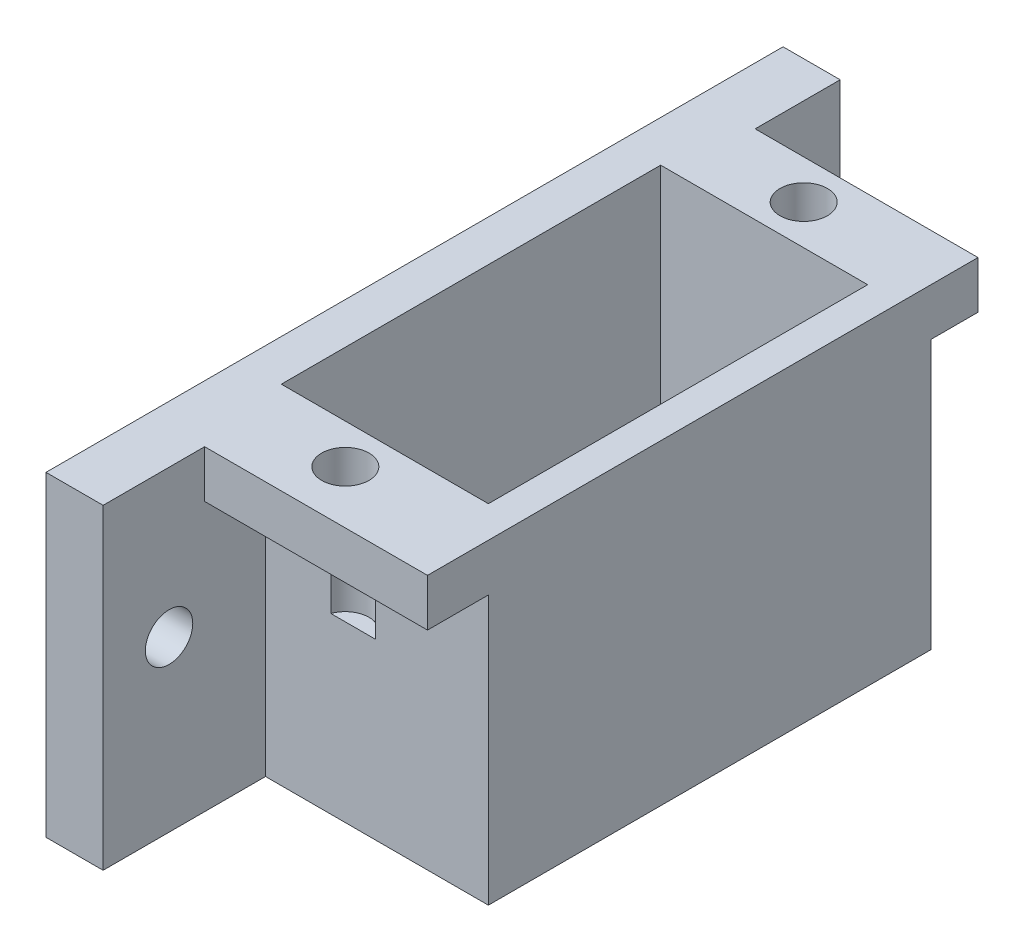
ISO-10303-21;
HEADER;
FILE_DESCRIPTION(('STEP AP214'),'2;1');
FILE_NAME('part.step','',(''),(''),'','','');
FILE_SCHEMA(('AUTOMOTIVE_DESIGN { 1 0 10303 214 1 1 1 1 }'));
ENDSEC;
DATA;
#1=APPLICATION_CONTEXT('core data for automotive mechanical design processes');
#2=APPLICATION_PROTOCOL_DEFINITION('international standard','automotive_design',2000,#1);
#3=PRODUCT_CONTEXT('',#1,'mechanical');
#4=PRODUCT('Part','Part','',(#3));
#5=PRODUCT_RELATED_PRODUCT_CATEGORY('part','',(#4));
#6=PRODUCT_DEFINITION_FORMATION('','',#4);
#7=PRODUCT_DEFINITION_CONTEXT('part definition',#1,'design');
#8=PRODUCT_DEFINITION('design','',#6,#7);
#9=PRODUCT_DEFINITION_SHAPE('','',#8);
#10=(LENGTH_UNIT() NAMED_UNIT(*) SI_UNIT(.MILLI.,.METRE.));
#11=(NAMED_UNIT(*) PLANE_ANGLE_UNIT() SI_UNIT($,.RADIAN.));
#12=(NAMED_UNIT(*) SI_UNIT($,.STERADIAN.) SOLID_ANGLE_UNIT());
#13=UNCERTAINTY_MEASURE_WITH_UNIT(LENGTH_MEASURE(1.E-05),#10,'distance_accuracy_value','');
#14=(GEOMETRIC_REPRESENTATION_CONTEXT(3) GLOBAL_UNCERTAINTY_ASSIGNED_CONTEXT((#13)) GLOBAL_UNIT_ASSIGNED_CONTEXT((#10,
#11,#12)) REPRESENTATION_CONTEXT('',''));
#15=CARTESIAN_POINT('',(0.,0.,0.));
#16=DIRECTION('',(0.,0.,1.));
#17=DIRECTION('',(1.,0.,0.));
#18=AXIS2_PLACEMENT_3D('',#15,#16,#17);
#19=CARTESIAN_POINT('',(0.,20.,-18.5));
#20=DIRECTION('',(0.,0.,-1.));
#21=DIRECTION('',(-1.,0.,0.));
#22=AXIS2_PLACEMENT_3D('',#19,#20,#21);
#23=PLANE('',#22);
#24=DIRECTION('',(0.,-1.,0.));
#25=VECTOR('',#24,1.);
#26=CARTESIAN_POINT('',(37.7037052749013,20.,-18.5));
#27=LINE('',#26,#25);
#28=CARTESIAN_POINT('',(37.7037052749013,17.,-18.5));
#29=VERTEX_POINT('',#28);
#30=CARTESIAN_POINT('',(37.7037052749013,0.,-18.5));
#31=VERTEX_POINT('',#30);
#32=EDGE_CURVE('E229',#29,#31,#27,.T.);
#33=ORIENTED_EDGE('',*,*,#32,.F.);
#34=DIRECTION('',(-1.,0.,0.));
#35=VECTOR('',#34,1.);
#36=CARTESIAN_POINT('',(0.,17.,-18.5));
#37=LINE('',#36,#35);
#38=CARTESIAN_POINT('',(41.8394917125282,17.,-18.5));
#39=VERTEX_POINT('',#38);
#40=EDGE_CURVE('E411',#39,#29,#37,.T.);
#41=ORIENTED_EDGE('',*,*,#40,.F.);
#42=DIRECTION('',(0.,-1.,0.));
#43=VECTOR('',#42,1.);
#44=CARTESIAN_POINT('',(41.8394917125282,20.,-18.5));
#45=LINE('',#44,#43);
#46=CARTESIAN_POINT('',(41.8394917125282,11.,-18.5));
#47=VERTEX_POINT('',#46);
#48=EDGE_CURVE('E51',#39,#47,#45,.T.);
#49=ORIENTED_EDGE('',*,*,#48,.T.);
#50=DIRECTION('',(1.,0.,0.));
#51=VECTOR('',#50,1.);
#52=CARTESIAN_POINT('',(0.,11.,-18.5));
#53=LINE('',#52,#51);
#54=CARTESIAN_POINT('',(44.6679188372744,11.,-18.5));
#55=VERTEX_POINT('',#54);
#56=EDGE_CURVE('E196',#47,#55,#53,.T.);
#57=ORIENTED_EDGE('',*,*,#56,.T.);
#58=DIRECTION('',(0.,-1.,0.));
#59=VECTOR('',#58,1.);
#60=CARTESIAN_POINT('',(44.6679188372744,20.,-18.5));
#61=LINE('',#60,#59);
#62=CARTESIAN_POINT('',(44.6679188372744,17.,-18.5));
#63=VERTEX_POINT('',#62);
#64=EDGE_CURVE('E11',#63,#55,#61,.T.);
#65=ORIENTED_EDGE('',*,*,#64,.F.);
#66=DIRECTION('',(-1.,0.,0.));
#67=VECTOR('',#66,1.);
#68=CARTESIAN_POINT('',(0.,17.,-18.5));
#69=LINE('',#68,#67);
#70=CARTESIAN_POINT('',(51.8037052749013,17.,-18.5));
#71=VERTEX_POINT('',#70);
#72=EDGE_CURVE('E62',#71,#63,#69,.T.);
#73=ORIENTED_EDGE('',*,*,#72,.F.);
#74=DIRECTION('',(0.,-1.,0.));
#75=VECTOR('',#74,1.);
#76=CARTESIAN_POINT('',(51.8037052749013,20.,-18.5));
#77=LINE('',#76,#75);
#78=CARTESIAN_POINT('',(51.8037052749013,0.,-18.5));
#79=VERTEX_POINT('',#78);
#80=EDGE_CURVE('E209',#71,#79,#77,.T.);
#81=ORIENTED_EDGE('',*,*,#80,.T.);
#82=DIRECTION('',(1.,0.,0.));
#83=VECTOR('',#82,1.);
#84=CARTESIAN_POINT('',(0.,0.,-18.5));
#85=LINE('',#84,#83);
#86=EDGE_CURVE('E284',#31,#79,#85,.T.);
#87=ORIENTED_EDGE('',*,*,#86,.F.);
#88=EDGE_LOOP('',(#33,#41,#49,#57,#65,#73,#81,#87));
#89=FACE_BOUND('',#88,.T.);
#90=ADVANCED_FACE('F41',(#89),#23,.T.);
#91=CARTESIAN_POINT('',(37.7037052749013,20.,0.));
#92=DIRECTION('',(-1.,0.,0.));
#93=DIRECTION('',(0.,0.,1.));
#94=AXIS2_PLACEMENT_3D('',#91,#92,#93);
#95=PLANE('',#94);
#96=CARTESIAN_POINT('',(37.7037052749013,10.2861607324723,-22.5684218846652));
#97=DIRECTION('',(-1.,0.,0.));
#98=DIRECTION('',(0.,0.,1.));
#99=AXIS2_PLACEMENT_3D('',#96,#97,#98);
#100=CIRCLE('',#99,1.5);
#101=CARTESIAN_POINT('',(37.7037052749013,10.2861607324723,-21.0684218846652));
#102=VERTEX_POINT('',#101);
#103=EDGE_CURVE('E301',#102,#102,#100,.F.);
#104=ORIENTED_EDGE('',*,*,#103,.F.);
#105=EDGE_LOOP('',(#104));
#106=FACE_BOUND('',#105,.T.);
#107=DIRECTION('',(0.,1.,0.));
#108=VECTOR('',#107,1.);
#109=CARTESIAN_POINT('',(37.7037052749013,17.,-21.4784011385849));
#110=LINE('',#109,#108);
#111=CARTESIAN_POINT('',(37.7037052749013,17.,-21.4784011385849));
#112=VERTEX_POINT('',#111);
#113=CARTESIAN_POINT('',(37.7037052749013,20.,-21.4784011385849));
#114=VERTEX_POINT('',#113);
#115=EDGE_CURVE('E368',#112,#114,#110,.T.);
#116=ORIENTED_EDGE('',*,*,#115,.F.);
#117=DIRECTION('',(0.,0.,1.));
#118=VECTOR('',#117,1.);
#119=CARTESIAN_POINT('',(37.7037052749013,17.,0.));
#120=LINE('',#119,#118);
#121=EDGE_CURVE('E407',#112,#29,#120,.T.);
#122=ORIENTED_EDGE('',*,*,#121,.T.);
#123=ORIENTED_EDGE('',*,*,#32,.T.);
#124=DIRECTION('',(0.,0.,-1.));
#125=VECTOR('',#124,1.);
#126=CARTESIAN_POINT('',(37.7037052749013,0.,0.));
#127=LINE('',#126,#125);
#128=CARTESIAN_POINT('',(37.7037052749013,0.,-26.8576345121729));
#129=VERTEX_POINT('',#128);
#130=EDGE_CURVE('E280',#31,#129,#127,.T.);
#131=ORIENTED_EDGE('',*,*,#130,.T.);
#132=DIRECTION('',(0.,-1.,0.));
#133=VECTOR('',#132,1.);
#134=CARTESIAN_POINT('',(37.7037052749013,20.,-26.8576345121729));
#135=LINE('',#134,#133);
#136=CARTESIAN_POINT('',(37.7037052749013,20.,-26.8576345121729));
#137=VERTEX_POINT('',#136);
#138=EDGE_CURVE('E226',#137,#129,#135,.T.);
#139=ORIENTED_EDGE('',*,*,#138,.F.);
#140=DIRECTION('',(0.,0.,-1.));
#141=VECTOR('',#140,1.);
#142=CARTESIAN_POINT('',(37.7037052749013,20.,0.));
#143=LINE('',#142,#141);
#144=EDGE_CURVE('E323',#114,#137,#143,.T.);
#145=ORIENTED_EDGE('',*,*,#144,.F.);
#146=EDGE_LOOP('',(#116,#122,#123,#131,#139,#145));
#147=FACE_BOUND('',#146,.T.);
#148=ADVANCED_FACE('F442',(#106,#147),#95,.F.);
#149=CARTESIAN_POINT('',(0.,20.,9.49999999999999));
#150=DIRECTION('',(0.,0.,-1.));
#151=DIRECTION('',(-1.,0.,0.));
#152=AXIS2_PLACEMENT_3D('',#149,#150,#151);
#153=PLANE('',#152);
#154=DIRECTION('',(-1.,0.,0.));
#155=VECTOR('',#154,1.);
#156=CARTESIAN_POINT('',(0.,17.,9.49999999999999));
#157=LINE('',#156,#155);
#158=CARTESIAN_POINT('',(51.8037052749013,17.,9.5));
#159=VERTEX_POINT('',#158);
#160=CARTESIAN_POINT('',(44.6679188372744,17.,9.5));
#161=VERTEX_POINT('',#160);
#162=EDGE_CURVE('E201',#159,#161,#157,.T.);
#163=ORIENTED_EDGE('',*,*,#162,.T.);
#164=DIRECTION('',(0.,-1.,0.));
#165=VECTOR('',#164,1.);
#166=CARTESIAN_POINT('',(44.6679188372744,20.,9.5));
#167=LINE('',#166,#165);
#168=CARTESIAN_POINT('',(44.6679188372744,11.,9.5));
#169=VERTEX_POINT('',#168);
#170=EDGE_CURVE('E193',#161,#169,#167,.T.);
#171=ORIENTED_EDGE('',*,*,#170,.T.);
#172=DIRECTION('',(1.,0.,0.));
#173=VECTOR('',#172,1.);
#174=CARTESIAN_POINT('',(0.,11.,9.49999999999999));
#175=LINE('',#174,#173);
#176=CARTESIAN_POINT('',(41.8394917125282,11.,9.5));
#177=VERTEX_POINT('',#176);
#178=EDGE_CURVE('E179',#177,#169,#175,.T.);
#179=ORIENTED_EDGE('',*,*,#178,.F.);
#180=DIRECTION('',(0.,-1.,0.));
#181=VECTOR('',#180,1.);
#182=CARTESIAN_POINT('',(41.8394917125282,20.,9.5));
#183=LINE('',#182,#181);
#184=CARTESIAN_POINT('',(41.8394917125282,17.,9.5));
#185=VERTEX_POINT('',#184);
#186=EDGE_CURVE('E194',#185,#177,#183,.T.);
#187=ORIENTED_EDGE('',*,*,#186,.F.);
#188=DIRECTION('',(-1.,0.,0.));
#189=VECTOR('',#188,1.);
#190=CARTESIAN_POINT('',(0.,17.,9.49999999999999));
#191=LINE('',#190,#189);
#192=CARTESIAN_POINT('',(37.7037052749013,17.,9.5));
#193=VERTEX_POINT('',#192);
#194=EDGE_CURVE('E379',#185,#193,#191,.T.);
#195=ORIENTED_EDGE('',*,*,#194,.T.);
#196=DIRECTION('',(0.,-1.,0.));
#197=VECTOR('',#196,1.);
#198=CARTESIAN_POINT('',(37.7037052749013,20.,9.5));
#199=LINE('',#198,#197);
#200=CARTESIAN_POINT('',(37.7037052749013,0.,9.5));
#201=VERTEX_POINT('',#200);
#202=EDGE_CURVE('E207',#193,#201,#199,.T.);
#203=ORIENTED_EDGE('',*,*,#202,.T.);
#204=DIRECTION('',(1.,0.,0.));
#205=VECTOR('',#204,1.);
#206=CARTESIAN_POINT('',(0.,0.,9.49999999999999));
#207=LINE('',#206,#205);
#208=CARTESIAN_POINT('',(51.8037052749013,0.,9.5));
#209=VERTEX_POINT('',#208);
#210=EDGE_CURVE('E260',#201,#209,#207,.T.);
#211=ORIENTED_EDGE('',*,*,#210,.T.);
#212=DIRECTION('',(0.,-1.,0.));
#213=VECTOR('',#212,1.);
#214=CARTESIAN_POINT('',(51.8037052749013,20.,9.5));
#215=LINE('',#214,#213);
#216=EDGE_CURVE('E203',#159,#209,#215,.T.);
#217=ORIENTED_EDGE('',*,*,#216,.F.);
#218=EDGE_LOOP('',(#163,#171,#179,#187,#195,#203,#211,#217));
#219=FACE_BOUND('',#218,.T.);
#220=ADVANCED_FACE('F199',(#219),#153,.F.);
#221=CARTESIAN_POINT('',(43.2537052749013,20.,-19.));
#222=DIRECTION('',(0.,-1.,0.));
#223=DIRECTION('',(0.,0.,-1.));
#224=AXIS2_PLACEMENT_3D('',#221,#222,#223);
#225=CYLINDRICAL_SURFACE('',#224,1.5);
#226=CARTESIAN_POINT('',(43.2537052749013,11.,-19.));
#227=DIRECTION('',(0.,1.,0.));
#228=DIRECTION('',(0.,0.,1.));
#229=AXIS2_PLACEMENT_3D('',#226,#227,#228);
#230=CIRCLE('',#229,1.5);
#231=EDGE_CURVE('E400',#47,#55,#230,.T.);
#232=ORIENTED_EDGE('',*,*,#231,.F.);
#233=ORIENTED_EDGE('',*,*,#48,.F.);
#234=CARTESIAN_POINT('',(43.2537052749013,17.,-19.));
#235=DIRECTION('',(0.,1.,0.));
#236=DIRECTION('',(0.,0.,1.));
#237=AXIS2_PLACEMENT_3D('',#234,#235,#236);
#238=CIRCLE('',#237,1.5);
#239=EDGE_CURVE('E414',#63,#39,#238,.T.);
#240=ORIENTED_EDGE('',*,*,#239,.F.);
#241=ORIENTED_EDGE('',*,*,#64,.T.);
#242=EDGE_LOOP('',(#232,#233,#240,#241));
#243=FACE_BOUND('',#242,.T.);
#244=CARTESIAN_POINT('',(43.2537052749013,20.,-19.));
#245=DIRECTION('',(0.,1.,0.));
#246=DIRECTION('',(0.,0.,1.));
#247=AXIS2_PLACEMENT_3D('',#244,#245,#246);
#248=CIRCLE('',#247,1.5);
#249=CARTESIAN_POINT('',(43.2537052749013,20.,-17.5));
#250=VERTEX_POINT('',#249);
#251=EDGE_CURVE('E326',#250,#250,#248,.T.);
#252=ORIENTED_EDGE('',*,*,#251,.T.);
#253=EDGE_LOOP('',(#252));
#254=FACE_BOUND('',#253,.T.);
#255=ADVANCED_FACE('F428',(#243,#254),#225,.F.);
#256=CARTESIAN_POINT('',(0.,20.,-26.8576345121729));
#257=DIRECTION('',(0.,0.,-1.));
#258=DIRECTION('',(-1.,0.,0.));
#259=AXIS2_PLACEMENT_3D('',#256,#257,#258);
#260=PLANE('',#259);
#261=DIRECTION('',(1.,0.,0.));
#262=VECTOR('',#261,1.);
#263=CARTESIAN_POINT('',(0.,0.,-26.8576345121729));
#264=LINE('',#263,#262);
#265=CARTESIAN_POINT('',(34.0906998355112,0.,-26.8576345121729));
#266=VERTEX_POINT('',#265);
#267=EDGE_CURVE('E276',#266,#129,#264,.T.);
#268=ORIENTED_EDGE('',*,*,#267,.F.);
#269=DIRECTION('',(0.,-1.,0.));
#270=VECTOR('',#269,1.);
#271=CARTESIAN_POINT('',(34.0906998355112,20.,-26.8576345121729));
#272=LINE('',#271,#270);
#273=CARTESIAN_POINT('',(34.0906998355112,20.,-26.8576345121729));
#274=VERTEX_POINT('',#273);
#275=EDGE_CURVE('E223',#274,#266,#272,.T.);
#276=ORIENTED_EDGE('',*,*,#275,.F.);
#277=DIRECTION('',(1.,0.,0.));
#278=VECTOR('',#277,1.);
#279=CARTESIAN_POINT('',(0.,20.,-26.8576345121729));
#280=LINE('',#279,#278);
#281=EDGE_CURVE('E319',#274,#137,#280,.T.);
#282=ORIENTED_EDGE('',*,*,#281,.T.);
#283=ORIENTED_EDGE('',*,*,#138,.T.);
#284=EDGE_LOOP('',(#268,#276,#282,#283));
#285=FACE_BOUND('',#284,.T.);
#286=ADVANCED_FACE('F475',(#285),#260,.T.);
#287=CARTESIAN_POINT('',(34.0906998355112,20.,0.));
#288=DIRECTION('',(1.,0.,0.));
#289=DIRECTION('',(0.,0.,-1.));
#290=AXIS2_PLACEMENT_3D('',#287,#288,#289);
#291=PLANE('',#290);
#292=CARTESIAN_POINT('',(34.0906998355112,10.6942498464128,15.6035460262899));
#293=DIRECTION('',(1.,0.,0.));
#294=DIRECTION('',(0.,0.,-1.));
#295=AXIS2_PLACEMENT_3D('',#292,#293,#294);
#296=CIRCLE('',#295,1.5);
#297=CARTESIAN_POINT('',(34.0906998355112,10.6942498464128,14.1035460262899));
#298=VERTEX_POINT('',#297);
#299=EDGE_CURVE('E351',#298,#298,#296,.T.);
#300=ORIENTED_EDGE('',*,*,#299,.T.);
#301=EDGE_LOOP('',(#300));
#302=FACE_BOUND('',#301,.T.);
#303=CARTESIAN_POINT('',(34.0906998355112,10.2861607324723,-22.5684218846652));
#304=DIRECTION('',(1.,0.,0.));
#305=DIRECTION('',(0.,0.,-1.));
#306=AXIS2_PLACEMENT_3D('',#303,#304,#305);
#307=CIRCLE('',#306,1.5);
#308=CARTESIAN_POINT('',(34.0906998355112,10.2861607324723,-24.0684218846652));
#309=VERTEX_POINT('',#308);
#310=EDGE_CURVE('E347',#309,#309,#307,.T.);
#311=ORIENTED_EDGE('',*,*,#310,.T.);
#312=EDGE_LOOP('',(#311));
#313=FACE_BOUND('',#312,.T.);
#314=DIRECTION('',(0.,0.,1.));
#315=VECTOR('',#314,1.);
#316=CARTESIAN_POINT('',(34.0906998355112,0.,0.));
#317=LINE('',#316,#315);
#318=CARTESIAN_POINT('',(34.0906998355112,0.,19.7761726632711));
#319=VERTEX_POINT('',#318);
#320=EDGE_CURVE('E272',#266,#319,#317,.T.);
#321=ORIENTED_EDGE('',*,*,#320,.T.);
#322=DIRECTION('',(0.,-1.,0.));
#323=VECTOR('',#322,1.);
#324=CARTESIAN_POINT('',(34.0906998355112,20.,19.7761726632711));
#325=LINE('',#324,#323);
#326=CARTESIAN_POINT('',(34.0906998355112,20.,19.7761726632711));
#327=VERTEX_POINT('',#326);
#328=EDGE_CURVE('E219',#327,#319,#325,.T.);
#329=ORIENTED_EDGE('',*,*,#328,.F.);
#330=DIRECTION('',(0.,0.,1.));
#331=VECTOR('',#330,1.);
#332=CARTESIAN_POINT('',(34.0906998355112,20.,0.));
#333=LINE('',#332,#331);
#334=EDGE_CURVE('E315',#274,#327,#333,.T.);
#335=ORIENTED_EDGE('',*,*,#334,.F.);
#336=ORIENTED_EDGE('',*,*,#275,.T.);
#337=EDGE_LOOP('',(#321,#329,#335,#336));
#338=FACE_BOUND('',#337,.T.);
#339=ADVANCED_FACE('F473',(#302,#313,#338),#291,.F.);
#340=CARTESIAN_POINT('',(0.,20.,19.7761726632711));
#341=DIRECTION('',(0.,0.,-1.));
#342=DIRECTION('',(-1.,0.,0.));
#343=AXIS2_PLACEMENT_3D('',#340,#341,#342);
#344=PLANE('',#343);
#345=DIRECTION('',(1.,0.,0.));
#346=VECTOR('',#345,1.);
#347=CARTESIAN_POINT('',(0.,0.,19.7761726632711));
#348=LINE('',#347,#346);
#349=CARTESIAN_POINT('',(37.7037052749013,0.,19.7761726632711));
#350=VERTEX_POINT('',#349);
#351=EDGE_CURVE('E268',#319,#350,#348,.T.);
#352=ORIENTED_EDGE('',*,*,#351,.T.);
#353=DIRECTION('',(0.,-1.,0.));
#354=VECTOR('',#353,1.);
#355=CARTESIAN_POINT('',(37.7037052749013,20.,19.7761726632711));
#356=LINE('',#355,#354);
#357=CARTESIAN_POINT('',(37.7037052749013,20.,19.7761726632711));
#358=VERTEX_POINT('',#357);
#359=EDGE_CURVE('E216',#358,#350,#356,.T.);
#360=ORIENTED_EDGE('',*,*,#359,.F.);
#361=DIRECTION('',(1.,0.,0.));
#362=VECTOR('',#361,1.);
#363=CARTESIAN_POINT('',(0.,20.,19.7761726632711));
#364=LINE('',#363,#362);
#365=EDGE_CURVE('E311',#327,#358,#364,.T.);
#366=ORIENTED_EDGE('',*,*,#365,.F.);
#367=ORIENTED_EDGE('',*,*,#328,.T.);
#368=EDGE_LOOP('',(#352,#360,#366,#367));
#369=FACE_BOUND('',#368,.T.);
#370=ADVANCED_FACE('F470',(#369),#344,.F.);
#371=CARTESIAN_POINT('',(37.7037052749013,20.,0.));
#372=DIRECTION('',(1.,0.,0.));
#373=DIRECTION('',(0.,0.,-1.));
#374=AXIS2_PLACEMENT_3D('',#371,#372,#373);
#375=PLANE('',#374);
#376=DIRECTION('',(0.,1.,0.));
#377=VECTOR('',#376,1.);
#378=CARTESIAN_POINT('',(37.7037052749013,17.,13.3519435182929));
#379=LINE('',#378,#377);
#380=CARTESIAN_POINT('',(37.7037052749013,17.,13.3519435182929));
#381=VERTEX_POINT('',#380);
#382=CARTESIAN_POINT('',(37.7037052749013,20.,13.3519435182929));
#383=VERTEX_POINT('',#382);
#384=EDGE_CURVE('E356',#381,#383,#379,.T.);
#385=ORIENTED_EDGE('',*,*,#384,.T.);
#386=DIRECTION('',(0.,0.,1.));
#387=VECTOR('',#386,1.);
#388=CARTESIAN_POINT('',(37.7037052749013,20.,0.));
#389=LINE('',#388,#387);
#390=EDGE_CURVE('E308',#383,#358,#389,.T.);
#391=ORIENTED_EDGE('',*,*,#390,.T.);
#392=ORIENTED_EDGE('',*,*,#359,.T.);
#393=DIRECTION('',(0.,0.,1.));
#394=VECTOR('',#393,1.);
#395=CARTESIAN_POINT('',(37.7037052749013,0.,0.));
#396=LINE('',#395,#394);
#397=EDGE_CURVE('E264',#201,#350,#396,.T.);
#398=ORIENTED_EDGE('',*,*,#397,.F.);
#399=ORIENTED_EDGE('',*,*,#202,.F.);
#400=DIRECTION('',(0.,0.,-1.));
#401=VECTOR('',#400,1.);
#402=CARTESIAN_POINT('',(37.7037052749013,17.,0.));
#403=LINE('',#402,#401);
#404=EDGE_CURVE('E376',#381,#193,#403,.T.);
#405=ORIENTED_EDGE('',*,*,#404,.F.);
#406=EDGE_LOOP('',(#385,#391,#392,#398,#399,#405));
#407=FACE_BOUND('',#406,.T.);
#408=CARTESIAN_POINT('',(37.7037052749013,10.6942498464128,15.6035460262899));
#409=DIRECTION('',(1.,0.,0.));
#410=DIRECTION('',(0.,0.,-1.));
#411=AXIS2_PLACEMENT_3D('',#408,#409,#410);
#412=CIRCLE('',#411,1.5);
#413=CARTESIAN_POINT('',(37.7037052749013,10.6942498464128,14.1035460262899));
#414=VERTEX_POINT('',#413);
#415=EDGE_CURVE('E45',#414,#414,#412,.F.);
#416=ORIENTED_EDGE('',*,*,#415,.T.);
#417=EDGE_LOOP('',(#416));
#418=FACE_BOUND('',#417,.T.);
#419=ADVANCED_FACE('F463',(#407,#418),#375,.T.);
#420=CARTESIAN_POINT('',(43.2537052749013,20.,10.));
#421=DIRECTION('',(0.,-1.,0.));
#422=DIRECTION('',(0.,0.,-1.));
#423=AXIS2_PLACEMENT_3D('',#420,#421,#422);
#424=CYLINDRICAL_SURFACE('',#423,1.5);
#425=CARTESIAN_POINT('',(43.2537052749013,11.,10.));
#426=DIRECTION('',(0.,1.,0.));
#427=DIRECTION('',(0.,0.,1.));
#428=AXIS2_PLACEMENT_3D('',#425,#426,#427);
#429=CIRCLE('',#428,1.5);
#430=EDGE_CURVE('E182',#169,#177,#429,.T.);
#431=ORIENTED_EDGE('',*,*,#430,.F.);
#432=ORIENTED_EDGE('',*,*,#170,.F.);
#433=CARTESIAN_POINT('',(43.2537052749013,17.,10.));
#434=DIRECTION('',(0.,1.,0.));
#435=DIRECTION('',(0.,0.,1.));
#436=AXIS2_PLACEMENT_3D('',#433,#434,#435);
#437=CIRCLE('',#436,1.5);
#438=EDGE_CURVE('E383',#185,#161,#437,.T.);
#439=ORIENTED_EDGE('',*,*,#438,.F.);
#440=ORIENTED_EDGE('',*,*,#186,.T.);
#441=EDGE_LOOP('',(#431,#432,#439,#440));
#442=FACE_BOUND('',#441,.T.);
#443=CARTESIAN_POINT('',(43.2537052749013,20.,10.));
#444=DIRECTION('',(0.,1.,0.));
#445=DIRECTION('',(0.,0.,1.));
#446=AXIS2_PLACEMENT_3D('',#443,#444,#445);
#447=CIRCLE('',#446,1.5);
#448=CARTESIAN_POINT('',(43.2537052749013,20.,11.5));
#449=VERTEX_POINT('',#448);
#450=EDGE_CURVE('E304',#449,#449,#447,.T.);
#451=ORIENTED_EDGE('',*,*,#450,.T.);
#452=EDGE_LOOP('',(#451));
#453=FACE_BOUND('',#452,.T.);
#454=ADVANCED_FACE('F191',(#442,#453),#424,.F.);
#455=CARTESIAN_POINT('',(0.,20.,-16.5));
#456=DIRECTION('',(0.,0.,-1.));
#457=DIRECTION('',(-1.,0.,0.));
#458=AXIS2_PLACEMENT_3D('',#455,#456,#457);
#459=PLANE('',#458);
#460=DIRECTION('',(1.,0.,0.));
#461=VECTOR('',#460,1.);
#462=CARTESIAN_POINT('',(0.,0.,-16.5));
#463=LINE('',#462,#461);
#464=CARTESIAN_POINT('',(36.7037052749013,0.,-16.5));
#465=VERTEX_POINT('',#464);
#466=CARTESIAN_POINT('',(49.8037052749013,0.,-16.5));
#467=VERTEX_POINT('',#466);
#468=EDGE_CURVE('E298',#465,#467,#463,.T.);
#469=ORIENTED_EDGE('',*,*,#468,.T.);
#470=DIRECTION('',(0.,-1.,0.));
#471=VECTOR('',#470,1.);
#472=CARTESIAN_POINT('',(49.8037052749013,20.,-16.5));
#473=LINE('',#472,#471);
#474=CARTESIAN_POINT('',(49.8037052749013,20.,-16.5));
#475=VERTEX_POINT('',#474);
#476=EDGE_CURVE('E244',#475,#467,#473,.T.);
#477=ORIENTED_EDGE('',*,*,#476,.F.);
#478=DIRECTION('',(1.,0.,0.));
#479=VECTOR('',#478,1.);
#480=CARTESIAN_POINT('',(0.,20.,-16.5));
#481=LINE('',#480,#479);
#482=CARTESIAN_POINT('',(36.7037052749013,20.,-16.5));
#483=VERTEX_POINT('',#482);
#484=EDGE_CURVE('E259',#483,#475,#481,.T.);
#485=ORIENTED_EDGE('',*,*,#484,.F.);
#486=DIRECTION('',(0.,-1.,0.));
#487=VECTOR('',#486,1.);
#488=CARTESIAN_POINT('',(36.7037052749013,20.,-16.5));
#489=LINE('',#488,#487);
#490=EDGE_CURVE('E235',#483,#465,#489,.T.);
#491=ORIENTED_EDGE('',*,*,#490,.T.);
#492=EDGE_LOOP('',(#469,#477,#485,#491));
#493=FACE_BOUND('',#492,.T.);
#494=ADVANCED_FACE('F43',(#493),#459,.F.);
#495=CARTESIAN_POINT('',(49.8037052749013,20.,0.));
#496=DIRECTION('',(1.,0.,0.));
#497=DIRECTION('',(0.,0.,-1.));
#498=AXIS2_PLACEMENT_3D('',#495,#496,#497);
#499=PLANE('',#498);
#500=DIRECTION('',(0.,0.,1.));
#501=VECTOR('',#500,1.);
#502=CARTESIAN_POINT('',(49.8037052749013,0.,0.));
#503=LINE('',#502,#501);
#504=CARTESIAN_POINT('',(49.8037052749013,0.,7.5));
#505=VERTEX_POINT('',#504);
#506=EDGE_CURVE('E295',#467,#505,#503,.T.);
#507=ORIENTED_EDGE('',*,*,#506,.T.);
#508=DIRECTION('',(0.,-1.,0.));
#509=VECTOR('',#508,1.);
#510=CARTESIAN_POINT('',(49.8037052749013,20.,7.5));
#511=LINE('',#510,#509);
#512=CARTESIAN_POINT('',(49.8037052749013,20.,7.5));
#513=VERTEX_POINT('',#512);
#514=EDGE_CURVE('E242',#513,#505,#511,.T.);
#515=ORIENTED_EDGE('',*,*,#514,.F.);
#516=DIRECTION('',(0.,0.,1.));
#517=VECTOR('',#516,1.);
#518=CARTESIAN_POINT('',(49.8037052749013,20.,0.));
#519=LINE('',#518,#517);
#520=EDGE_CURVE('E338',#475,#513,#519,.T.);
#521=ORIENTED_EDGE('',*,*,#520,.F.);
#522=ORIENTED_EDGE('',*,*,#476,.T.);
#523=EDGE_LOOP('',(#507,#515,#521,#522));
#524=FACE_BOUND('',#523,.T.);
#525=ADVANCED_FACE('F499',(#524),#499,.F.);
#526=CARTESIAN_POINT('',(0.,20.,7.5));
#527=DIRECTION('',(0.,0.,-1.));
#528=DIRECTION('',(-1.,0.,0.));
#529=AXIS2_PLACEMENT_3D('',#526,#527,#528);
#530=PLANE('',#529);
#531=DIRECTION('',(1.,0.,0.));
#532=VECTOR('',#531,1.);
#533=CARTESIAN_POINT('',(0.,0.,7.5));
#534=LINE('',#533,#532);
#535=CARTESIAN_POINT('',(36.7037052749013,0.,7.5));
#536=VERTEX_POINT('',#535);
#537=EDGE_CURVE('E291',#536,#505,#534,.T.);
#538=ORIENTED_EDGE('',*,*,#537,.F.);
#539=DIRECTION('',(0.,-1.,0.));
#540=VECTOR('',#539,1.);
#541=CARTESIAN_POINT('',(36.7037052749013,20.,7.5));
#542=LINE('',#541,#540);
#543=CARTESIAN_POINT('',(36.7037052749013,20.,7.5));
#544=VERTEX_POINT('',#543);
#545=EDGE_CURVE('E238',#544,#536,#542,.T.);
#546=ORIENTED_EDGE('',*,*,#545,.F.);
#547=DIRECTION('',(1.,0.,0.));
#548=VECTOR('',#547,1.);
#549=CARTESIAN_POINT('',(0.,20.,7.5));
#550=LINE('',#549,#548);
#551=EDGE_CURVE('E334',#544,#513,#550,.T.);
#552=ORIENTED_EDGE('',*,*,#551,.T.);
#553=ORIENTED_EDGE('',*,*,#514,.T.);
#554=EDGE_LOOP('',(#538,#546,#552,#553));
#555=FACE_BOUND('',#554,.T.);
#556=ADVANCED_FACE('F496',(#555),#530,.T.);
#557=CARTESIAN_POINT('',(36.7037052749013,20.,0.));
#558=DIRECTION('',(1.,0.,0.));
#559=DIRECTION('',(0.,0.,-1.));
#560=AXIS2_PLACEMENT_3D('',#557,#558,#559);
#561=PLANE('',#560);
#562=DIRECTION('',(0.,0.,1.));
#563=VECTOR('',#562,1.);
#564=CARTESIAN_POINT('',(36.7037052749013,0.,0.));
#565=LINE('',#564,#563);
#566=EDGE_CURVE('E287',#465,#536,#565,.T.);
#567=ORIENTED_EDGE('',*,*,#566,.F.);
#568=ORIENTED_EDGE('',*,*,#490,.F.);
#569=DIRECTION('',(0.,0.,1.));
#570=VECTOR('',#569,1.);
#571=CARTESIAN_POINT('',(36.7037052749013,20.,0.));
#572=LINE('',#571,#570);
#573=EDGE_CURVE('E330',#483,#544,#572,.T.);
#574=ORIENTED_EDGE('',*,*,#573,.T.);
#575=ORIENTED_EDGE('',*,*,#545,.T.);
#576=EDGE_LOOP('',(#567,#568,#574,#575));
#577=FACE_BOUND('',#576,.T.);
#578=ADVANCED_FACE('F493',(#577),#561,.T.);
#579=CARTESIAN_POINT('',(51.8037052749013,20.,0.));
#580=DIRECTION('',(1.,0.,0.));
#581=DIRECTION('',(0.,0.,-1.));
#582=AXIS2_PLACEMENT_3D('',#579,#580,#581);
#583=PLANE('',#582);
#584=DIRECTION('',(0.,0.,1.));
#585=VECTOR('',#584,1.);
#586=CARTESIAN_POINT('',(51.8037052749013,0.,0.));
#587=LINE('',#586,#585);
#588=EDGE_CURVE('E255',#79,#209,#587,.T.);
#589=ORIENTED_EDGE('',*,*,#588,.F.);
#590=ORIENTED_EDGE('',*,*,#80,.F.);
#591=DIRECTION('',(0.,0.,1.));
#592=VECTOR('',#591,1.);
#593=CARTESIAN_POINT('',(51.8037052749013,17.,0.));
#594=LINE('',#593,#592);
#595=CARTESIAN_POINT('',(51.8037052749013,17.,-21.4784011385849));
#596=VERTEX_POINT('',#595);
#597=EDGE_CURVE('E395',#596,#71,#594,.T.);
#598=ORIENTED_EDGE('',*,*,#597,.F.);
#599=DIRECTION('',(0.,1.,0.));
#600=VECTOR('',#599,1.);
#601=CARTESIAN_POINT('',(51.8037052749013,17.,-21.4784011385849));
#602=LINE('',#601,#600);
#603=CARTESIAN_POINT('',(51.8037052749013,20.,-21.4784011385849));
#604=VERTEX_POINT('',#603);
#605=EDGE_CURVE('E391',#596,#604,#602,.T.);
#606=ORIENTED_EDGE('',*,*,#605,.T.);
#607=DIRECTION('',(0.,0.,1.));
#608=VECTOR('',#607,1.);
#609=CARTESIAN_POINT('',(51.8037052749013,20.,0.));
#610=LINE('',#609,#608);
#611=CARTESIAN_POINT('',(51.8037052749013,20.,13.3519435182929));
#612=VERTEX_POINT('',#611);
#613=EDGE_CURVE('E239',#604,#612,#610,.T.);
#614=ORIENTED_EDGE('',*,*,#613,.T.);
#615=DIRECTION('',(0.,1.,0.));
#616=VECTOR('',#615,1.);
#617=CARTESIAN_POINT('',(51.8037052749013,17.,13.3519435182929));
#618=LINE('',#617,#616);
#619=CARTESIAN_POINT('',(51.8037052749013,17.,13.3519435182929));
#620=VERTEX_POINT('',#619);
#621=EDGE_CURVE('E352',#620,#612,#618,.T.);
#622=ORIENTED_EDGE('',*,*,#621,.F.);
#623=DIRECTION('',(0.,0.,-1.));
#624=VECTOR('',#623,1.);
#625=CARTESIAN_POINT('',(51.8037052749013,17.,0.));
#626=LINE('',#625,#624);
#627=EDGE_CURVE('E360',#620,#159,#626,.T.);
#628=ORIENTED_EDGE('',*,*,#627,.T.);
#629=ORIENTED_EDGE('',*,*,#216,.T.);
#630=EDGE_LOOP('',(#589,#590,#598,#606,#614,#622,#628,#629));
#631=FACE_BOUND('',#630,.T.);
#632=ADVANCED_FACE('F436',(#631),#583,.T.);
#633=CARTESIAN_POINT('',(0.,20.,0.));
#634=DIRECTION('',(0.,1.,0.));
#635=DIRECTION('',(0.,0.,1.));
#636=AXIS2_PLACEMENT_3D('',#633,#634,#635);
#637=PLANE('',#636);
#638=ORIENTED_EDGE('',*,*,#613,.F.);
#639=DIRECTION('',(1.,0.,0.));
#640=VECTOR('',#639,1.);
#641=CARTESIAN_POINT('',(0.,20.,-21.4784011385849));
#642=LINE('',#641,#640);
#643=EDGE_CURVE('E396',#114,#604,#642,.T.);
#644=ORIENTED_EDGE('',*,*,#643,.F.);
#645=ORIENTED_EDGE('',*,*,#144,.T.);
#646=ORIENTED_EDGE('',*,*,#281,.F.);
#647=ORIENTED_EDGE('',*,*,#334,.T.);
#648=ORIENTED_EDGE('',*,*,#365,.T.);
#649=ORIENTED_EDGE('',*,*,#390,.F.);
#650=DIRECTION('',(1.,0.,0.));
#651=VECTOR('',#650,1.);
#652=CARTESIAN_POINT('',(0.,20.,13.3519435182929));
#653=LINE('',#652,#651);
#654=EDGE_CURVE('E364',#383,#612,#653,.T.);
#655=ORIENTED_EDGE('',*,*,#654,.T.);
#656=EDGE_LOOP('',(#638,#644,#645,#646,#647,#648,#649,#655));
#657=FACE_BOUND('',#656,.T.);
#658=ORIENTED_EDGE('',*,*,#251,.F.);
#659=EDGE_LOOP('',(#658));
#660=FACE_BOUND('',#659,.T.);
#661=ORIENTED_EDGE('',*,*,#450,.F.);
#662=EDGE_LOOP('',(#661));
#663=FACE_BOUND('',#662,.T.);
#664=ORIENTED_EDGE('',*,*,#484,.T.);
#665=ORIENTED_EDGE('',*,*,#520,.T.);
#666=ORIENTED_EDGE('',*,*,#551,.F.);
#667=ORIENTED_EDGE('',*,*,#573,.F.);
#668=EDGE_LOOP('',(#664,#665,#666,#667));
#669=FACE_BOUND('',#668,.T.);
#670=ADVANCED_FACE('F448',(#657,#660,#663,#669),#637,.T.);
#671=CARTESIAN_POINT('',(0.,0.,0.));
#672=DIRECTION('',(0.,1.,0.));
#673=DIRECTION('',(0.,0.,1.));
#674=AXIS2_PLACEMENT_3D('',#671,#672,#673);
#675=PLANE('',#674);
#676=ORIENTED_EDGE('',*,*,#468,.F.);
#677=ORIENTED_EDGE('',*,*,#566,.T.);
#678=ORIENTED_EDGE('',*,*,#537,.T.);
#679=ORIENTED_EDGE('',*,*,#506,.F.);
#680=EDGE_LOOP('',(#676,#677,#678,#679));
#681=FACE_BOUND('',#680,.T.);
#682=ORIENTED_EDGE('',*,*,#86,.T.);
#683=ORIENTED_EDGE('',*,*,#588,.T.);
#684=ORIENTED_EDGE('',*,*,#210,.F.);
#685=ORIENTED_EDGE('',*,*,#397,.T.);
#686=ORIENTED_EDGE('',*,*,#351,.F.);
#687=ORIENTED_EDGE('',*,*,#320,.F.);
#688=ORIENTED_EDGE('',*,*,#267,.T.);
#689=ORIENTED_EDGE('',*,*,#130,.F.);
#690=EDGE_LOOP('',(#682,#683,#684,#685,#686,#687,#688,#689));
#691=FACE_BOUND('',#690,.T.);
#692=ADVANCED_FACE('F438',(#681,#691),#675,.F.);
#693=CARTESIAN_POINT('',(51.8037052749013,10.6942498464128,15.6035460262899));
#694=DIRECTION('',(-1.,0.,0.));
#695=DIRECTION('',(0.,0.,1.));
#696=AXIS2_PLACEMENT_3D('',#693,#694,#695);
#697=CYLINDRICAL_SURFACE('',#696,1.5);
#698=ORIENTED_EDGE('',*,*,#415,.F.);
#699=EDGE_LOOP('',(#698));
#700=FACE_BOUND('',#699,.T.);
#701=ORIENTED_EDGE('',*,*,#299,.F.);
#702=EDGE_LOOP('',(#701));
#703=FACE_BOUND('',#702,.T.);
#704=ADVANCED_FACE('F521',(#700,#703),#697,.F.);
#705=CARTESIAN_POINT('',(51.8037052749013,10.2861607324723,-22.5684218846652));
#706=DIRECTION('',(-1.,0.,0.));
#707=DIRECTION('',(0.,0.,1.));
#708=AXIS2_PLACEMENT_3D('',#705,#706,#707);
#709=CYLINDRICAL_SURFACE('',#708,1.5);
#710=ORIENTED_EDGE('',*,*,#310,.F.);
#711=EDGE_LOOP('',(#710));
#712=FACE_BOUND('',#711,.T.);
#713=ORIENTED_EDGE('',*,*,#103,.T.);
#714=EDGE_LOOP('',(#713));
#715=FACE_BOUND('',#714,.T.);
#716=ADVANCED_FACE('F525',(#712,#715),#709,.F.);
#717=CARTESIAN_POINT('',(0.,17.,13.3519435182929));
#718=DIRECTION('',(0.,0.,1.));
#719=DIRECTION('',(1.,0.,0.));
#720=AXIS2_PLACEMENT_3D('',#717,#718,#719);
#721=PLANE('',#720);
#722=ORIENTED_EDGE('',*,*,#654,.F.);
#723=ORIENTED_EDGE('',*,*,#384,.F.);
#724=DIRECTION('',(1.,0.,0.));
#725=VECTOR('',#724,1.);
#726=CARTESIAN_POINT('',(0.,17.,13.3519435182929));
#727=LINE('',#726,#725);
#728=EDGE_CURVE('E372',#381,#620,#727,.T.);
#729=ORIENTED_EDGE('',*,*,#728,.T.);
#730=ORIENTED_EDGE('',*,*,#621,.T.);
#731=EDGE_LOOP('',(#722,#723,#729,#730));
#732=FACE_BOUND('',#731,.T.);
#733=ADVANCED_FACE('F453',(#732),#721,.T.);
#734=CARTESIAN_POINT('',(43.2537052749013,17.,10.));
#735=DIRECTION('',(0.,1.,0.));
#736=DIRECTION('',(0.,0.,1.));
#737=AXIS2_PLACEMENT_3D('',#734,#735,#736);
#738=PLANE('',#737);
#739=ORIENTED_EDGE('',*,*,#162,.F.);
#740=ORIENTED_EDGE('',*,*,#627,.F.);
#741=ORIENTED_EDGE('',*,*,#728,.F.);
#742=ORIENTED_EDGE('',*,*,#404,.T.);
#743=ORIENTED_EDGE('',*,*,#194,.F.);
#744=ORIENTED_EDGE('',*,*,#438,.T.);
#745=EDGE_LOOP('',(#739,#740,#741,#742,#743,#744));
#746=FACE_BOUND('',#745,.T.);
#747=ADVANCED_FACE('F458',(#746),#738,.F.);
#748=CARTESIAN_POINT('',(0.,17.,-21.4784011385849));
#749=DIRECTION('',(0.,0.,1.));
#750=DIRECTION('',(1.,0.,0.));
#751=AXIS2_PLACEMENT_3D('',#748,#749,#750);
#752=PLANE('',#751);
#753=ORIENTED_EDGE('',*,*,#643,.T.);
#754=ORIENTED_EDGE('',*,*,#605,.F.);
#755=DIRECTION('',(1.,0.,0.));
#756=VECTOR('',#755,1.);
#757=CARTESIAN_POINT('',(0.,17.,-21.4784011385849));
#758=LINE('',#757,#756);
#759=EDGE_CURVE('E404',#112,#596,#758,.T.);
#760=ORIENTED_EDGE('',*,*,#759,.F.);
#761=ORIENTED_EDGE('',*,*,#115,.T.);
#762=EDGE_LOOP('',(#753,#754,#760,#761));
#763=FACE_BOUND('',#762,.T.);
#764=ADVANCED_FACE('F446',(#763),#752,.F.);
#765=CARTESIAN_POINT('',(43.2537052749013,17.,-19.));
#766=DIRECTION('',(0.,1.,0.));
#767=DIRECTION('',(0.,0.,1.));
#768=AXIS2_PLACEMENT_3D('',#765,#766,#767);
#769=PLANE('',#768);
#770=ORIENTED_EDGE('',*,*,#72,.T.);
#771=ORIENTED_EDGE('',*,*,#239,.T.);
#772=ORIENTED_EDGE('',*,*,#40,.T.);
#773=ORIENTED_EDGE('',*,*,#121,.F.);
#774=ORIENTED_EDGE('',*,*,#759,.T.);
#775=ORIENTED_EDGE('',*,*,#597,.T.);
#776=EDGE_LOOP('',(#770,#771,#772,#773,#774,#775));
#777=FACE_BOUND('',#776,.T.);
#778=ADVANCED_FACE('F431',(#777),#769,.F.);
#779=CARTESIAN_POINT('',(0.,11.,0.));
#780=DIRECTION('',(0.,1.,0.));
#781=DIRECTION('',(0.,0.,1.));
#782=AXIS2_PLACEMENT_3D('',#779,#780,#781);
#783=PLANE('',#782);
#784=ORIENTED_EDGE('',*,*,#56,.F.);
#785=ORIENTED_EDGE('',*,*,#231,.T.);
#786=EDGE_LOOP('',(#784,#785));
#787=FACE_BOUND('',#786,.T.);
#788=ADVANCED_FACE('F685',(#787),#783,.T.);
#789=CARTESIAN_POINT('',(0.,11.,0.));
#790=DIRECTION('',(0.,1.,0.));
#791=DIRECTION('',(0.,0.,1.));
#792=AXIS2_PLACEMENT_3D('',#789,#790,#791);
#793=PLANE('',#792);
#794=ORIENTED_EDGE('',*,*,#178,.T.);
#795=ORIENTED_EDGE('',*,*,#430,.T.);
#796=EDGE_LOOP('',(#794,#795));
#797=FACE_BOUND('',#796,.T.);
#798=ADVANCED_FACE('F181',(#797),#793,.T.);
#799=CLOSED_SHELL('',(#90,#148,#220,#255,#286,#339,#370,#419,#454,#494,#525,#556,#578,#632,#670,
#692,#704,#716,#733,#747,#764,#778,#788,#798));
#800=MANIFOLD_SOLID_BREP('B2',#799);
#801=ADVANCED_BREP_SHAPE_REPRESENTATION('',(#18,#800),#14);
#802=SHAPE_DEFINITION_REPRESENTATION(#9,#801);
ENDSEC;
END-ISO-10303-21;
